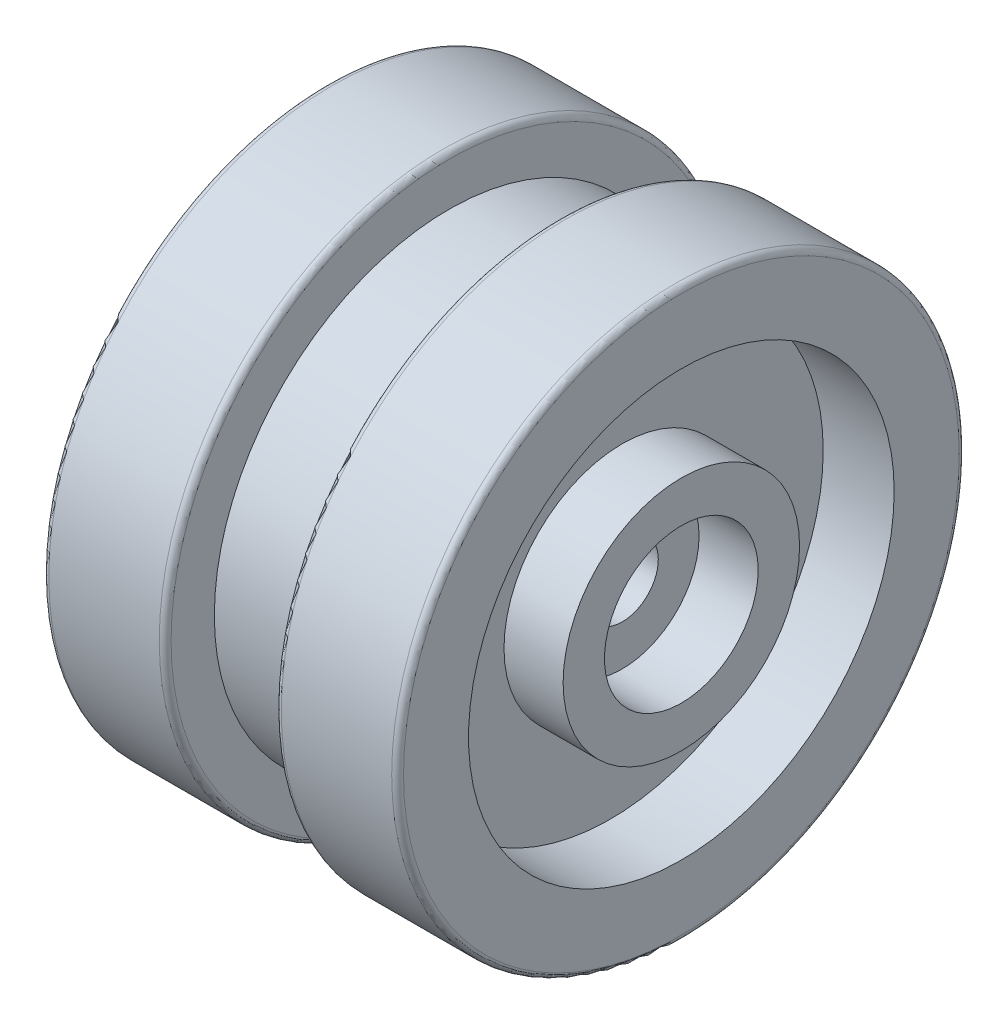
ISO-10303-21;
HEADER;
FILE_DESCRIPTION(('STEP AP214'),'2;1');
FILE_NAME('part.step','',(''),(''),'','','');
FILE_SCHEMA(('AUTOMOTIVE_DESIGN { 1 0 10303 214 1 1 1 1 }'));
ENDSEC;
DATA;
#1=APPLICATION_CONTEXT('core data for automotive mechanical design processes');
#2=APPLICATION_PROTOCOL_DEFINITION('international standard','automotive_design',2000,#1);
#3=PRODUCT_CONTEXT('',#1,'mechanical');
#4=PRODUCT('Part','Part','',(#3));
#5=PRODUCT_RELATED_PRODUCT_CATEGORY('part','',(#4));
#6=PRODUCT_DEFINITION_FORMATION('','',#4);
#7=PRODUCT_DEFINITION_CONTEXT('part definition',#1,'design');
#8=PRODUCT_DEFINITION('design','',#6,#7);
#9=PRODUCT_DEFINITION_SHAPE('','',#8);
#10=(LENGTH_UNIT() NAMED_UNIT(*) SI_UNIT(.MILLI.,.METRE.));
#11=(NAMED_UNIT(*) PLANE_ANGLE_UNIT() SI_UNIT($,.RADIAN.));
#12=(NAMED_UNIT(*) SI_UNIT($,.STERADIAN.) SOLID_ANGLE_UNIT());
#13=UNCERTAINTY_MEASURE_WITH_UNIT(LENGTH_MEASURE(1.E-05),#10,'distance_accuracy_value','');
#14=(GEOMETRIC_REPRESENTATION_CONTEXT(3) GLOBAL_UNCERTAINTY_ASSIGNED_CONTEXT((#13)) GLOBAL_UNIT_ASSIGNED_CONTEXT((#10,
#11,#12)) REPRESENTATION_CONTEXT('',''));
#15=CARTESIAN_POINT('',(0.,0.,0.));
#16=DIRECTION('',(0.,0.,1.));
#17=DIRECTION('',(1.,0.,0.));
#18=AXIS2_PLACEMENT_3D('',#15,#16,#17);
#19=CARTESIAN_POINT('',(7.57479912463906,-18.4842605379604,0.));
#20=DIRECTION('',(1.,0.,0.));
#21=DIRECTION('',(0.,0.,-1.));
#22=AXIS2_PLACEMENT_3D('',#19,#20,#21);
#23=CYLINDRICAL_SURFACE('',#22,8.);
#24=CARTESIAN_POINT('',(11.5747991246391,-18.4842605379604,0.));
#25=DIRECTION('',(1.,0.,0.));
#26=DIRECTION('',(0.,0.,-1.));
#27=AXIS2_PLACEMENT_3D('',#24,#25,#26);
#28=CIRCLE('',#27,8.);
#29=CARTESIAN_POINT('',(11.5747991246391,-18.4842605379604,-8.));
#30=VERTEX_POINT('',#29);
#31=EDGE_CURVE('E10',#30,#30,#28,.T.);
#32=ORIENTED_EDGE('',*,*,#31,.T.);
#33=EDGE_LOOP('',(#32));
#34=FACE_BOUND('',#33,.T.);
#35=CARTESIAN_POINT('',(12.5747991246391,-18.4842605379604,0.));
#36=DIRECTION('',(1.,0.,0.));
#37=DIRECTION('',(0.,0.,-1.));
#38=AXIS2_PLACEMENT_3D('',#35,#36,#37);
#39=CIRCLE('',#38,8.);
#40=CARTESIAN_POINT('',(12.5747991246391,-18.4842605379604,-8.));
#41=VERTEX_POINT('',#40);
#42=EDGE_CURVE('E54',#41,#41,#39,.F.);
#43=ORIENTED_EDGE('',*,*,#42,.T.);
#44=EDGE_LOOP('',(#43));
#45=FACE_BOUND('',#44,.T.);
#46=ADVANCED_FACE('F39',(#34,#45),#23,.T.);
#47=CARTESIAN_POINT('',(-2.08520087536094,1.35573946203964,0.));
#48=DIRECTION('',(-1.,0.,0.));
#49=DIRECTION('',(0.,0.,1.));
#50=AXIS2_PLACEMENT_3D('',#47,#48,#49);
#51=PLANE('',#50);
#52=CARTESIAN_POINT('',(-2.08520087536094,-18.4842605379604,0.));
#53=DIRECTION('',(-1.,0.,0.));
#54=DIRECTION('',(0.,0.,1.));
#55=AXIS2_PLACEMENT_3D('',#52,#53,#54);
#56=CIRCLE('',#55,23.5);
#57=CARTESIAN_POINT('',(-2.08520087536094,-18.4842605379604,23.5));
#58=VERTEX_POINT('',#57);
#59=EDGE_CURVE('E55',#58,#58,#56,.F.);
#60=ORIENTED_EDGE('',*,*,#59,.T.);
#61=EDGE_LOOP('',(#60));
#62=FACE_BOUND('',#61,.T.);
#63=CARTESIAN_POINT('',(-2.08520087536094,-18.4842605379604,0.));
#64=DIRECTION('',(-1.,0.,0.));
#65=DIRECTION('',(0.,0.,1.));
#66=AXIS2_PLACEMENT_3D('',#63,#64,#65);
#67=CIRCLE('',#66,19.84);
#68=CARTESIAN_POINT('',(-2.08520087536094,-18.4842605379604,19.84));
#69=VERTEX_POINT('',#68);
#70=EDGE_CURVE('E93',#69,#69,#67,.T.);
#71=ORIENTED_EDGE('',*,*,#70,.T.);
#72=EDGE_LOOP('',(#71));
#73=FACE_BOUND('',#72,.T.);
#74=ADVANCED_FACE('F125',(#62,#73),#51,.F.);
#75=CARTESIAN_POINT('',(-12.4252008753609,-18.4842605379604,0.));
#76=DIRECTION('',(-1.,0.,0.));
#77=DIRECTION('',(0.,0.,1.));
#78=AXIS2_PLACEMENT_3D('',#75,#76,#77);
#79=CYLINDRICAL_SURFACE('',#78,24.);
#80=CARTESIAN_POINT('',(-11.9252008753609,-18.4842605379604,0.));
#81=DIRECTION('',(1.,0.,0.));
#82=DIRECTION('',(0.,0.,-1.));
#83=AXIS2_PLACEMENT_3D('',#80,#81,#82);
#84=CIRCLE('',#83,24.);
#85=CARTESIAN_POINT('',(-11.9252008753609,-18.4842605379604,-24.));
#86=VERTEX_POINT('',#85);
#87=EDGE_CURVE('E120',#86,#86,#84,.T.);
#88=ORIENTED_EDGE('',*,*,#87,.T.);
#89=EDGE_LOOP('',(#88));
#90=FACE_BOUND('',#89,.T.);
#91=CARTESIAN_POINT('',(-2.58520087536094,-18.4842605379604,0.));
#92=DIRECTION('',(-1.,0.,0.));
#93=DIRECTION('',(0.,0.,1.));
#94=AXIS2_PLACEMENT_3D('',#91,#92,#93);
#95=CIRCLE('',#94,24.);
#96=CARTESIAN_POINT('',(-2.58520087536094,-18.4842605379604,24.));
#97=VERTEX_POINT('',#96);
#98=EDGE_CURVE('E112',#97,#97,#95,.T.);
#99=ORIENTED_EDGE('',*,*,#98,.T.);
#100=EDGE_LOOP('',(#99));
#101=FACE_BOUND('',#100,.T.);
#102=ADVANCED_FACE('F132',(#90,#101),#79,.T.);
#103=CARTESIAN_POINT('',(-12.4252008753609,5.51573946203964,0.));
#104=DIRECTION('',(1.,0.,0.));
#105=DIRECTION('',(0.,0.,-1.));
#106=AXIS2_PLACEMENT_3D('',#103,#104,#105);
#107=PLANE('',#106);
#108=CARTESIAN_POINT('',(-12.4252008753609,-18.4842605379604,0.));
#109=DIRECTION('',(-1.,0.,0.));
#110=DIRECTION('',(0.,0.,1.));
#111=AXIS2_PLACEMENT_3D('',#108,#109,#110);
#112=CIRCLE('',#111,18.);
#113=CARTESIAN_POINT('',(-12.4252008753609,-18.4842605379604,18.));
#114=VERTEX_POINT('',#113);
#115=EDGE_CURVE('E85',#114,#114,#112,.T.);
#116=ORIENTED_EDGE('',*,*,#115,.F.);
#117=EDGE_LOOP('',(#116));
#118=FACE_BOUND('',#117,.T.);
#119=CARTESIAN_POINT('',(-12.4252008753609,-18.4842605379604,0.));
#120=DIRECTION('',(1.,0.,0.));
#121=DIRECTION('',(0.,0.,-1.));
#122=AXIS2_PLACEMENT_3D('',#119,#120,#121);
#123=CIRCLE('',#122,23.5);
#124=CARTESIAN_POINT('',(-12.4252008753609,-18.4842605379604,-23.5));
#125=VERTEX_POINT('',#124);
#126=EDGE_CURVE('E111',#125,#125,#123,.F.);
#127=ORIENTED_EDGE('',*,*,#126,.T.);
#128=EDGE_LOOP('',(#127));
#129=FACE_BOUND('',#128,.T.);
#130=ADVANCED_FACE('F134',(#118,#129),#107,.F.);
#131=CARTESIAN_POINT('',(17.5747991246391,-18.4842605379604,0.));
#132=DIRECTION('',(-1.,0.,0.));
#133=DIRECTION('',(0.,0.,1.));
#134=AXIS2_PLACEMENT_3D('',#131,#132,#133);
#135=PLANE('',#134);
#136=CARTESIAN_POINT('',(17.5747991246391,-18.4842605379604,0.));
#137=DIRECTION('',(1.,0.,0.));
#138=DIRECTION('',(0.,0.,-1.));
#139=AXIS2_PLACEMENT_3D('',#136,#137,#138);
#140=CIRCLE('',#139,18.);
#141=CARTESIAN_POINT('',(17.5747991246391,-18.4842605379604,-18.));
#142=VERTEX_POINT('',#141);
#143=EDGE_CURVE('E89',#142,#142,#140,.T.);
#144=ORIENTED_EDGE('',*,*,#143,.F.);
#145=EDGE_LOOP('',(#144));
#146=FACE_BOUND('',#145,.T.);
#147=CARTESIAN_POINT('',(17.5747991246391,-18.4842605379604,0.));
#148=DIRECTION('',(-1.,0.,0.));
#149=DIRECTION('',(0.,0.,1.));
#150=AXIS2_PLACEMENT_3D('',#147,#148,#149);
#151=CIRCLE('',#150,23.5);
#152=CARTESIAN_POINT('',(17.5747991246391,-18.4842605379604,23.5));
#153=VERTEX_POINT('',#152);
#154=EDGE_CURVE('E108',#153,#153,#151,.F.);
#155=ORIENTED_EDGE('',*,*,#154,.T.);
#156=EDGE_LOOP('',(#155));
#157=FACE_BOUND('',#156,.T.);
#158=ADVANCED_FACE('F142',(#146,#157),#135,.F.);
#159=CARTESIAN_POINT('',(-12.4252008753609,-18.4842605379604,0.));
#160=DIRECTION('',(-1.,0.,0.));
#161=DIRECTION('',(0.,0.,1.));
#162=AXIS2_PLACEMENT_3D('',#159,#160,#161);
#163=CYLINDRICAL_SURFACE('',#162,24.);
#164=CARTESIAN_POINT('',(17.0747991246391,-18.4842605379604,0.));
#165=DIRECTION('',(-1.,0.,0.));
#166=DIRECTION('',(0.,0.,1.));
#167=AXIS2_PLACEMENT_3D('',#164,#165,#166);
#168=CIRCLE('',#167,24.);
#169=CARTESIAN_POINT('',(17.0747991246391,-18.4842605379604,24.));
#170=VERTEX_POINT('',#169);
#171=EDGE_CURVE('E102',#170,#170,#168,.T.);
#172=ORIENTED_EDGE('',*,*,#171,.T.);
#173=EDGE_LOOP('',(#172));
#174=FACE_BOUND('',#173,.T.);
#175=CARTESIAN_POINT('',(7.73479912463906,-18.4842605379604,0.));
#176=DIRECTION('',(1.,0.,0.));
#177=DIRECTION('',(0.,0.,-1.));
#178=AXIS2_PLACEMENT_3D('',#175,#176,#177);
#179=CIRCLE('',#178,24.);
#180=CARTESIAN_POINT('',(7.73479912463906,-18.4842605379604,-24.));
#181=VERTEX_POINT('',#180);
#182=EDGE_CURVE('E105',#181,#181,#179,.T.);
#183=ORIENTED_EDGE('',*,*,#182,.T.);
#184=EDGE_LOOP('',(#183));
#185=FACE_BOUND('',#184,.T.);
#186=ADVANCED_FACE('F190',(#174,#185),#163,.T.);
#187=CARTESIAN_POINT('',(7.23479912463906,1.35573946203964,0.));
#188=DIRECTION('',(1.,0.,0.));
#189=DIRECTION('',(0.,0.,-1.));
#190=AXIS2_PLACEMENT_3D('',#187,#188,#189);
#191=PLANE('',#190);
#192=CARTESIAN_POINT('',(7.23479912463906,-18.4842605379604,0.));
#193=DIRECTION('',(1.,0.,0.));
#194=DIRECTION('',(0.,0.,-1.));
#195=AXIS2_PLACEMENT_3D('',#192,#193,#194);
#196=CIRCLE('',#195,23.5);
#197=CARTESIAN_POINT('',(7.23479912463906,-18.4842605379604,-23.5));
#198=VERTEX_POINT('',#197);
#199=EDGE_CURVE('E50',#198,#198,#196,.F.);
#200=ORIENTED_EDGE('',*,*,#199,.T.);
#201=EDGE_LOOP('',(#200));
#202=FACE_BOUND('',#201,.T.);
#203=CARTESIAN_POINT('',(7.23479912463906,-18.4842605379604,0.));
#204=DIRECTION('',(-1.,0.,0.));
#205=DIRECTION('',(0.,0.,1.));
#206=AXIS2_PLACEMENT_3D('',#203,#204,#205);
#207=CIRCLE('',#206,19.84);
#208=CARTESIAN_POINT('',(7.23479912463906,-18.4842605379604,19.84));
#209=VERTEX_POINT('',#208);
#210=EDGE_CURVE('E100',#209,#209,#207,.T.);
#211=ORIENTED_EDGE('',*,*,#210,.F.);
#212=EDGE_LOOP('',(#211));
#213=FACE_BOUND('',#212,.T.);
#214=ADVANCED_FACE('F182',(#202,#213),#191,.F.);
#215=CARTESIAN_POINT('',(-12.4252008753609,-18.4842605379604,0.));
#216=DIRECTION('',(-1.,0.,0.));
#217=DIRECTION('',(0.,0.,1.));
#218=AXIS2_PLACEMENT_3D('',#215,#216,#217);
#219=CYLINDRICAL_SURFACE('',#218,19.84);
#220=ORIENTED_EDGE('',*,*,#70,.F.);
#221=EDGE_LOOP('',(#220));
#222=FACE_BOUND('',#221,.T.);
#223=ORIENTED_EDGE('',*,*,#210,.T.);
#224=EDGE_LOOP('',(#223));
#225=FACE_BOUND('',#224,.T.);
#226=ADVANCED_FACE('F177',(#222,#225),#219,.T.);
#227=CARTESIAN_POINT('',(17.0747991246391,-18.4842605379604,0.));
#228=DIRECTION('',(-1.,0.,0.));
#229=DIRECTION('',(0.,0.,1.));
#230=AXIS2_PLACEMENT_3D('',#227,#228,#229);
#231=TOROIDAL_SURFACE('',#230,23.5,0.5);
#232=ORIENTED_EDGE('',*,*,#154,.F.);
#233=EDGE_LOOP('',(#232));
#234=FACE_BOUND('',#233,.T.);
#235=ORIENTED_EDGE('',*,*,#171,.F.);
#236=EDGE_LOOP('',(#235));
#237=FACE_BOUND('',#236,.T.);
#238=ADVANCED_FACE('F185',(#234,#237),#231,.T.);
#239=CARTESIAN_POINT('',(-11.9252008753609,-18.4842605379604,0.));
#240=DIRECTION('',(1.,0.,0.));
#241=DIRECTION('',(0.,0.,-1.));
#242=AXIS2_PLACEMENT_3D('',#239,#240,#241);
#243=TOROIDAL_SURFACE('',#242,23.5,0.5);
#244=ORIENTED_EDGE('',*,*,#87,.F.);
#245=EDGE_LOOP('',(#244));
#246=FACE_BOUND('',#245,.T.);
#247=ORIENTED_EDGE('',*,*,#126,.F.);
#248=EDGE_LOOP('',(#247));
#249=FACE_BOUND('',#248,.T.);
#250=ADVANCED_FACE('F127',(#246,#249),#243,.T.);
#251=CARTESIAN_POINT('',(-2.58520087536094,-18.4842605379604,0.));
#252=DIRECTION('',(-1.,0.,0.));
#253=DIRECTION('',(0.,0.,1.));
#254=AXIS2_PLACEMENT_3D('',#251,#252,#253);
#255=TOROIDAL_SURFACE('',#254,23.5,0.5);
#256=ORIENTED_EDGE('',*,*,#59,.F.);
#257=EDGE_LOOP('',(#256));
#258=FACE_BOUND('',#257,.T.);
#259=ORIENTED_EDGE('',*,*,#98,.F.);
#260=EDGE_LOOP('',(#259));
#261=FACE_BOUND('',#260,.T.);
#262=ADVANCED_FACE('F123',(#258,#261),#255,.T.);
#263=CARTESIAN_POINT('',(7.73479912463906,-18.4842605379604,0.));
#264=DIRECTION('',(1.,0.,0.));
#265=DIRECTION('',(0.,0.,-1.));
#266=AXIS2_PLACEMENT_3D('',#263,#264,#265);
#267=TOROIDAL_SURFACE('',#266,23.5,0.5);
#268=ORIENTED_EDGE('',*,*,#182,.F.);
#269=EDGE_LOOP('',(#268));
#270=FACE_BOUND('',#269,.T.);
#271=ORIENTED_EDGE('',*,*,#199,.F.);
#272=EDGE_LOOP('',(#271));
#273=FACE_BOUND('',#272,.T.);
#274=ADVANCED_FACE('F41',(#270,#273),#267,.T.);
#275=CARTESIAN_POINT('',(11.5747991246391,-18.4842605379604,0.));
#276=DIRECTION('',(1.,0.,0.));
#277=DIRECTION('',(0.,0.,-1.));
#278=AXIS2_PLACEMENT_3D('',#275,#276,#277);
#279=CYLINDRICAL_SURFACE('',#278,18.);
#280=CARTESIAN_POINT('',(11.5747991246391,-18.4842605379604,0.));
#281=DIRECTION('',(1.,0.,0.));
#282=DIRECTION('',(0.,0.,-1.));
#283=AXIS2_PLACEMENT_3D('',#280,#281,#282);
#284=CIRCLE('',#283,18.);
#285=CARTESIAN_POINT('',(11.5747991246391,-18.4842605379604,-18.));
#286=VERTEX_POINT('',#285);
#287=EDGE_CURVE('E91',#286,#286,#284,.T.);
#288=ORIENTED_EDGE('',*,*,#287,.F.);
#289=EDGE_LOOP('',(#288));
#290=FACE_BOUND('',#289,.T.);
#291=ORIENTED_EDGE('',*,*,#143,.T.);
#292=EDGE_LOOP('',(#291));
#293=FACE_BOUND('',#292,.T.);
#294=ADVANCED_FACE('F172',(#290,#293),#279,.F.);
#295=CARTESIAN_POINT('',(11.5747991246391,-18.4842605379604,0.));
#296=DIRECTION('',(1.,0.,0.));
#297=DIRECTION('',(0.,0.,-1.));
#298=AXIS2_PLACEMENT_3D('',#295,#296,#297);
#299=PLANE('',#298);
#300=ORIENTED_EDGE('',*,*,#31,.F.);
#301=EDGE_LOOP('',(#300));
#302=FACE_BOUND('',#301,.T.);
#303=ORIENTED_EDGE('',*,*,#287,.T.);
#304=EDGE_LOOP('',(#303));
#305=FACE_BOUND('',#304,.T.);
#306=ADVANCED_FACE('F170',(#302,#305),#299,.T.);
#307=CARTESIAN_POINT('',(-6.42520087536094,-18.4842605379604,0.));
#308=DIRECTION('',(-1.,0.,0.));
#309=DIRECTION('',(0.,0.,1.));
#310=AXIS2_PLACEMENT_3D('',#307,#308,#309);
#311=PLANE('',#310);
#312=CARTESIAN_POINT('',(-6.42520087536094,-18.4842605379604,0.));
#313=DIRECTION('',(-1.,0.,0.));
#314=DIRECTION('',(0.,0.,1.));
#315=AXIS2_PLACEMENT_3D('',#312,#313,#314);
#316=CIRCLE('',#315,10.);
#317=CARTESIAN_POINT('',(-6.42520087536094,-18.4842605379604,10.));
#318=VERTEX_POINT('',#317);
#319=EDGE_CURVE('E80',#318,#318,#316,.T.);
#320=ORIENTED_EDGE('',*,*,#319,.F.);
#321=EDGE_LOOP('',(#320));
#322=FACE_BOUND('',#321,.T.);
#323=CARTESIAN_POINT('',(-6.42520087536094,-18.4842605379604,0.));
#324=DIRECTION('',(-1.,0.,0.));
#325=DIRECTION('',(0.,0.,1.));
#326=AXIS2_PLACEMENT_3D('',#323,#324,#325);
#327=CIRCLE('',#326,18.);
#328=CARTESIAN_POINT('',(-6.42520087536094,-18.4842605379604,18.));
#329=VERTEX_POINT('',#328);
#330=EDGE_CURVE('E84',#329,#329,#327,.T.);
#331=ORIENTED_EDGE('',*,*,#330,.T.);
#332=EDGE_LOOP('',(#331));
#333=FACE_BOUND('',#332,.T.);
#334=ADVANCED_FACE('F165',(#322,#333),#311,.T.);
#335=CARTESIAN_POINT('',(-6.42520087536094,-18.4842605379604,0.));
#336=DIRECTION('',(-1.,0.,0.));
#337=DIRECTION('',(0.,0.,1.));
#338=AXIS2_PLACEMENT_3D('',#335,#336,#337);
#339=CYLINDRICAL_SURFACE('',#338,18.);
#340=ORIENTED_EDGE('',*,*,#330,.F.);
#341=EDGE_LOOP('',(#340));
#342=FACE_BOUND('',#341,.T.);
#343=ORIENTED_EDGE('',*,*,#115,.T.);
#344=EDGE_LOOP('',(#343));
#345=FACE_BOUND('',#344,.T.);
#346=ADVANCED_FACE('F158',(#342,#345),#339,.F.);
#347=CARTESIAN_POINT('',(-12.4252008753609,-18.4842605379604,0.));
#348=DIRECTION('',(-1.,0.,0.));
#349=DIRECTION('',(0.,0.,1.));
#350=AXIS2_PLACEMENT_3D('',#347,#348,#349);
#351=PLANE('',#350);
#352=CARTESIAN_POINT('',(-12.4252008753609,-18.4842605379604,0.));
#353=DIRECTION('',(-1.,0.,0.));
#354=DIRECTION('',(0.,0.,1.));
#355=AXIS2_PLACEMENT_3D('',#352,#353,#354);
#356=CIRCLE('',#355,6.5);
#357=CARTESIAN_POINT('',(-12.4252008753609,-18.4842605379604,6.5));
#358=VERTEX_POINT('',#357);
#359=EDGE_CURVE('E60',#358,#358,#356,.T.);
#360=ORIENTED_EDGE('',*,*,#359,.F.);
#361=EDGE_LOOP('',(#360));
#362=FACE_BOUND('',#361,.T.);
#363=CARTESIAN_POINT('',(-12.4252008753609,-18.4842605379604,0.));
#364=DIRECTION('',(-1.,0.,0.));
#365=DIRECTION('',(0.,0.,1.));
#366=AXIS2_PLACEMENT_3D('',#363,#364,#365);
#367=CIRCLE('',#366,10.);
#368=CARTESIAN_POINT('',(-12.4252008753609,-18.4842605379604,10.));
#369=VERTEX_POINT('',#368);
#370=EDGE_CURVE('E79',#369,#369,#367,.T.);
#371=ORIENTED_EDGE('',*,*,#370,.T.);
#372=EDGE_LOOP('',(#371));
#373=FACE_BOUND('',#372,.T.);
#374=ADVANCED_FACE('F153',(#362,#373),#351,.T.);
#375=CARTESIAN_POINT('',(-12.4252008753609,-18.4842605379604,0.));
#376=DIRECTION('',(1.,0.,0.));
#377=DIRECTION('',(0.,0.,-1.));
#378=AXIS2_PLACEMENT_3D('',#375,#376,#377);
#379=CYLINDRICAL_SURFACE('',#378,10.);
#380=ORIENTED_EDGE('',*,*,#370,.F.);
#381=EDGE_LOOP('',(#380));
#382=FACE_BOUND('',#381,.T.);
#383=ORIENTED_EDGE('',*,*,#319,.T.);
#384=EDGE_LOOP('',(#383));
#385=FACE_BOUND('',#384,.T.);
#386=ADVANCED_FACE('F157',(#382,#385),#379,.T.);
#387=CARTESIAN_POINT('',(-7.42520087536094,-18.4842605379604,0.));
#388=DIRECTION('',(-1.,0.,0.));
#389=DIRECTION('',(0.,0.,1.));
#390=AXIS2_PLACEMENT_3D('',#387,#388,#389);
#391=CYLINDRICAL_SURFACE('',#390,6.5);
#392=CARTESIAN_POINT('',(-7.42520087536094,-18.4842605379604,0.));
#393=DIRECTION('',(-1.,0.,0.));
#394=DIRECTION('',(0.,0.,1.));
#395=AXIS2_PLACEMENT_3D('',#392,#393,#394);
#396=CIRCLE('',#395,6.5);
#397=CARTESIAN_POINT('',(-7.42520087536094,-18.4842605379604,6.5));
#398=VERTEX_POINT('',#397);
#399=EDGE_CURVE('E65',#398,#398,#396,.T.);
#400=ORIENTED_EDGE('',*,*,#399,.F.);
#401=EDGE_LOOP('',(#400));
#402=FACE_BOUND('',#401,.T.);
#403=ORIENTED_EDGE('',*,*,#359,.T.);
#404=EDGE_LOOP('',(#403));
#405=FACE_BOUND('',#404,.T.);
#406=ADVANCED_FACE('F154',(#402,#405),#391,.F.);
#407=CARTESIAN_POINT('',(-7.42520087536094,-18.4842605379604,0.));
#408=DIRECTION('',(-1.,0.,0.));
#409=DIRECTION('',(0.,0.,1.));
#410=AXIS2_PLACEMENT_3D('',#407,#408,#409);
#411=PLANE('',#410);
#412=CARTESIAN_POINT('',(-7.42520087536094,-18.4842605379604,0.));
#413=DIRECTION('',(-1.,0.,0.));
#414=DIRECTION('',(0.,0.,1.));
#415=AXIS2_PLACEMENT_3D('',#412,#413,#414);
#416=CIRCLE('',#415,3.05);
#417=CARTESIAN_POINT('',(-7.42520087536094,-18.4842605379604,3.05));
#418=VERTEX_POINT('',#417);
#419=EDGE_CURVE('E236',#418,#418,#416,.T.);
#420=ORIENTED_EDGE('',*,*,#419,.F.);
#421=EDGE_LOOP('',(#420));
#422=FACE_BOUND('',#421,.T.);
#423=ORIENTED_EDGE('',*,*,#399,.T.);
#424=EDGE_LOOP('',(#423));
#425=FACE_BOUND('',#424,.T.);
#426=ADVANCED_FACE('F219',(#422,#425),#411,.T.);
#427=CARTESIAN_POINT('',(12.5747991246391,-18.4842605379604,0.));
#428=DIRECTION('',(1.,0.,0.));
#429=DIRECTION('',(0.,0.,-1.));
#430=AXIS2_PLACEMENT_3D('',#427,#428,#429);
#431=CYLINDRICAL_SURFACE('',#430,10.);
#432=CARTESIAN_POINT('',(12.5747991246391,-18.4842605379604,0.));
#433=DIRECTION('',(1.,0.,0.));
#434=DIRECTION('',(0.,0.,-1.));
#435=AXIS2_PLACEMENT_3D('',#432,#433,#434);
#436=CIRCLE('',#435,10.);
#437=CARTESIAN_POINT('',(12.5747991246391,-18.4842605379604,-10.));
#438=VERTEX_POINT('',#437);
#439=EDGE_CURVE('E59',#438,#438,#436,.T.);
#440=ORIENTED_EDGE('',*,*,#439,.T.);
#441=EDGE_LOOP('',(#440));
#442=FACE_BOUND('',#441,.T.);
#443=CARTESIAN_POINT('',(17.5747991246391,-18.4842605379604,0.));
#444=DIRECTION('',(1.,0.,0.));
#445=DIRECTION('',(0.,0.,-1.));
#446=AXIS2_PLACEMENT_3D('',#443,#444,#445);
#447=CIRCLE('',#446,10.);
#448=CARTESIAN_POINT('',(17.5747991246391,-18.4842605379604,-10.));
#449=VERTEX_POINT('',#448);
#450=EDGE_CURVE('E64',#449,#449,#447,.T.);
#451=ORIENTED_EDGE('',*,*,#450,.F.);
#452=EDGE_LOOP('',(#451));
#453=FACE_BOUND('',#452,.T.);
#454=ADVANCED_FACE('F208',(#442,#453),#431,.T.);
#455=CARTESIAN_POINT('',(12.5747991246391,-18.4842605379604,0.));
#456=DIRECTION('',(1.,0.,0.));
#457=DIRECTION('',(0.,0.,-1.));
#458=AXIS2_PLACEMENT_3D('',#455,#456,#457);
#459=PLANE('',#458);
#460=ORIENTED_EDGE('',*,*,#42,.F.);
#461=EDGE_LOOP('',(#460));
#462=FACE_BOUND('',#461,.T.);
#463=ORIENTED_EDGE('',*,*,#439,.F.);
#464=EDGE_LOOP('',(#463));
#465=FACE_BOUND('',#464,.T.);
#466=ADVANCED_FACE('F201',(#462,#465),#459,.F.);
#467=CARTESIAN_POINT('',(17.5747991246391,-18.4842605379604,0.));
#468=DIRECTION('',(1.,0.,0.));
#469=DIRECTION('',(0.,0.,-1.));
#470=AXIS2_PLACEMENT_3D('',#467,#468,#469);
#471=CIRCLE('',#470,6.5);
#472=CARTESIAN_POINT('',(17.5747991246391,-18.4842605379604,-6.5));
#473=VERTEX_POINT('',#472);
#474=EDGE_CURVE('E72',#473,#473,#471,.T.);
#475=ORIENTED_EDGE('',*,*,#474,.F.);
#476=EDGE_LOOP('',(#475));
#477=FACE_BOUND('',#476,.T.);
#478=ORIENTED_EDGE('',*,*,#450,.T.);
#479=EDGE_LOOP('',(#478));
#480=FACE_BOUND('',#479,.T.);
#481=ADVANCED_FACE('F192',(#477,#480),#135,.F.);
#482=CARTESIAN_POINT('',(12.5747991246391,-18.4842605379604,0.));
#483=DIRECTION('',(1.,0.,0.));
#484=DIRECTION('',(0.,0.,-1.));
#485=AXIS2_PLACEMENT_3D('',#482,#483,#484);
#486=CYLINDRICAL_SURFACE('',#485,6.5);
#487=CARTESIAN_POINT('',(12.5747991246391,-18.4842605379604,0.));
#488=DIRECTION('',(1.,0.,0.));
#489=DIRECTION('',(0.,0.,-1.));
#490=AXIS2_PLACEMENT_3D('',#487,#488,#489);
#491=CIRCLE('',#490,6.5);
#492=CARTESIAN_POINT('',(12.5747991246391,-18.4842605379604,-6.5));
#493=VERTEX_POINT('',#492);
#494=EDGE_CURVE('E68',#493,#493,#491,.T.);
#495=ORIENTED_EDGE('',*,*,#494,.F.);
#496=EDGE_LOOP('',(#495));
#497=FACE_BOUND('',#496,.T.);
#498=ORIENTED_EDGE('',*,*,#474,.T.);
#499=EDGE_LOOP('',(#498));
#500=FACE_BOUND('',#499,.T.);
#501=ADVANCED_FACE('F198',(#497,#500),#486,.F.);
#502=CARTESIAN_POINT('',(12.5747991246391,-18.4842605379604,0.));
#503=DIRECTION('',(1.,0.,0.));
#504=DIRECTION('',(0.,0.,-1.));
#505=AXIS2_PLACEMENT_3D('',#502,#503,#504);
#506=PLANE('',#505);
#507=CARTESIAN_POINT('',(12.5747991246391,-18.4842605379604,0.));
#508=DIRECTION('',(1.,0.,0.));
#509=DIRECTION('',(0.,0.,-1.));
#510=AXIS2_PLACEMENT_3D('',#507,#508,#509);
#511=CIRCLE('',#510,3.05);
#512=CARTESIAN_POINT('',(12.5747991246391,-18.4842605379604,-3.05));
#513=VERTEX_POINT('',#512);
#514=EDGE_CURVE('E43',#513,#513,#511,.T.);
#515=ORIENTED_EDGE('',*,*,#514,.F.);
#516=EDGE_LOOP('',(#515));
#517=FACE_BOUND('',#516,.T.);
#518=ORIENTED_EDGE('',*,*,#494,.T.);
#519=EDGE_LOOP('',(#518));
#520=FACE_BOUND('',#519,.T.);
#521=ADVANCED_FACE('F210',(#517,#520),#506,.T.);
#522=CARTESIAN_POINT('',(17.5747991246391,-18.4842605379604,0.));
#523=DIRECTION('',(-1.,0.,0.));
#524=DIRECTION('',(0.,0.,1.));
#525=AXIS2_PLACEMENT_3D('',#522,#523,#524);
#526=CYLINDRICAL_SURFACE('',#525,3.05);
#527=ORIENTED_EDGE('',*,*,#419,.T.);
#528=EDGE_LOOP('',(#527));
#529=FACE_BOUND('',#528,.T.);
#530=ORIENTED_EDGE('',*,*,#514,.T.);
#531=EDGE_LOOP('',(#530));
#532=FACE_BOUND('',#531,.T.);
#533=ADVANCED_FACE('F227',(#529,#532),#526,.F.);
#534=CLOSED_SHELL('',(#46,#74,#102,#130,#158,#186,#214,#226,#238,#250,#262,#274,#294,#306,#334,
#346,#374,#386,#406,#426,#454,#466,#481,#501,#521,#533));
#535=MANIFOLD_SOLID_BREP('B2',#534);
#536=ADVANCED_BREP_SHAPE_REPRESENTATION('',(#18,#535),#14);
#537=SHAPE_DEFINITION_REPRESENTATION(#9,#536);
ENDSEC;
END-ISO-10303-21;
